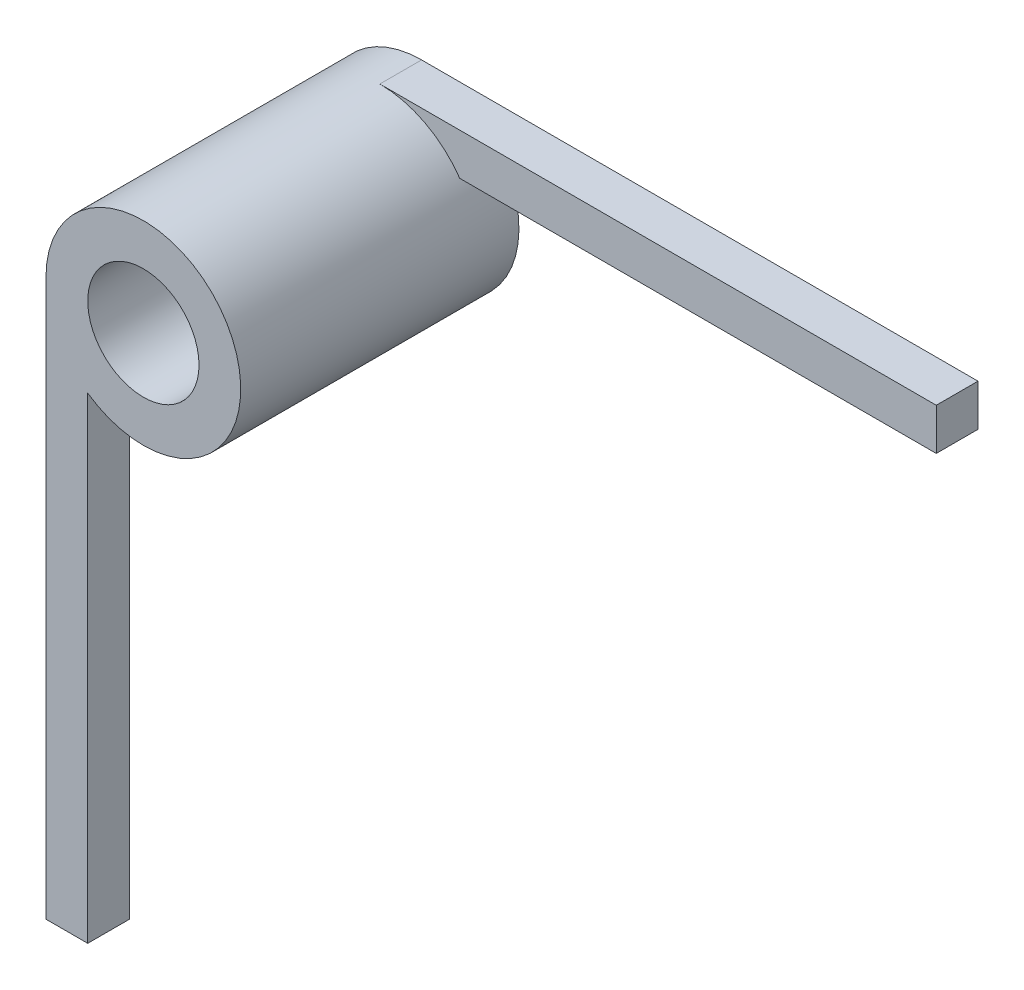
ISO-10303-21;
HEADER;
FILE_DESCRIPTION(('STEP AP214'),'2;1');
FILE_NAME('part.step','',(''),(''),'','','');
FILE_SCHEMA(('AUTOMOTIVE_DESIGN { 1 0 10303 214 1 1 1 1 }'));
ENDSEC;
DATA;
#1=APPLICATION_CONTEXT('core data for automotive mechanical design processes');
#2=APPLICATION_PROTOCOL_DEFINITION('international standard','automotive_design',2000,#1);
#3=PRODUCT_CONTEXT('',#1,'mechanical');
#4=PRODUCT('Part','Part','',(#3));
#5=PRODUCT_RELATED_PRODUCT_CATEGORY('part','',(#4));
#6=PRODUCT_DEFINITION_FORMATION('','',#4);
#7=PRODUCT_DEFINITION_CONTEXT('part definition',#1,'design');
#8=PRODUCT_DEFINITION('design','',#6,#7);
#9=PRODUCT_DEFINITION_SHAPE('','',#8);
#10=(LENGTH_UNIT() NAMED_UNIT(*) SI_UNIT(.MILLI.,.METRE.));
#11=(NAMED_UNIT(*) PLANE_ANGLE_UNIT() SI_UNIT($,.RADIAN.));
#12=(NAMED_UNIT(*) SI_UNIT($,.STERADIAN.) SOLID_ANGLE_UNIT());
#13=UNCERTAINTY_MEASURE_WITH_UNIT(LENGTH_MEASURE(1.E-05),#10,'distance_accuracy_value','');
#14=(GEOMETRIC_REPRESENTATION_CONTEXT(3) GLOBAL_UNCERTAINTY_ASSIGNED_CONTEXT((#13)) GLOBAL_UNIT_ASSIGNED_CONTEXT((#10,
#11,#12)) REPRESENTATION_CONTEXT('',''));
#15=CARTESIAN_POINT('',(0.,0.,0.));
#16=DIRECTION('',(0.,0.,1.));
#17=DIRECTION('',(1.,0.,0.));
#18=AXIS2_PLACEMENT_3D('',#15,#16,#17);
#19=CARTESIAN_POINT('',(0.,0.,2.5));
#20=DIRECTION('',(0.,0.,1.));
#21=DIRECTION('',(1.,0.,0.));
#22=AXIS2_PLACEMENT_3D('',#19,#20,#21);
#23=PLANE('',#22);
#24=CARTESIAN_POINT('',(0.,0.,2.5));
#25=DIRECTION('',(0.,0.,1.));
#26=DIRECTION('',(1.,0.,0.));
#27=AXIS2_PLACEMENT_3D('',#24,#25,#26);
#28=CIRCLE('',#27,1.75);
#29=CARTESIAN_POINT('',(-1.,-1.43614066163451,2.5));
#30=VERTEX_POINT('',#29);
#31=CARTESIAN_POINT('',(-1.75,0.,2.5));
#32=VERTEX_POINT('',#31);
#33=EDGE_CURVE('E11',#30,#32,#28,.T.);
#34=ORIENTED_EDGE('',*,*,#33,.T.);
#35=DIRECTION('',(0.,-1.,0.));
#36=VECTOR('',#35,1.);
#37=CARTESIAN_POINT('',(-1.75,0.,2.5));
#38=LINE('',#37,#36);
#39=CARTESIAN_POINT('',(-1.75,-10.,2.5));
#40=VERTEX_POINT('',#39);
#41=EDGE_CURVE('E132',#32,#40,#38,.T.);
#42=ORIENTED_EDGE('',*,*,#41,.T.);
#43=DIRECTION('',(1.,0.,0.));
#44=VECTOR('',#43,1.);
#45=CARTESIAN_POINT('',(-1.75,-10.,2.5));
#46=LINE('',#45,#44);
#47=CARTESIAN_POINT('',(-1.,-10.,2.5));
#48=VERTEX_POINT('',#47);
#49=EDGE_CURVE('E146',#40,#48,#46,.T.);
#50=ORIENTED_EDGE('',*,*,#49,.T.);
#51=DIRECTION('',(0.,1.,0.));
#52=VECTOR('',#51,1.);
#53=CARTESIAN_POINT('',(-1.,-10.,2.5));
#54=LINE('',#53,#52);
#55=EDGE_CURVE('E137',#48,#30,#54,.T.);
#56=ORIENTED_EDGE('',*,*,#55,.T.);
#57=EDGE_LOOP('',(#34,#42,#50,#56));
#58=FACE_BOUND('',#57,.T.);
#59=CARTESIAN_POINT('',(0.,0.,2.5));
#60=DIRECTION('',(0.,0.,1.));
#61=DIRECTION('',(1.,0.,0.));
#62=AXIS2_PLACEMENT_3D('',#59,#60,#61);
#63=CIRCLE('',#62,1.);
#64=CARTESIAN_POINT('',(1.,0.,2.5));
#65=VERTEX_POINT('',#64);
#66=EDGE_CURVE('E162',#65,#65,#63,.T.);
#67=ORIENTED_EDGE('',*,*,#66,.F.);
#68=EDGE_LOOP('',(#67));
#69=FACE_BOUND('',#68,.T.);
#70=ADVANCED_FACE('F33',(#58,#69),#23,.T.);
#71=CARTESIAN_POINT('',(0.,0.,-2.5));
#72=DIRECTION('',(0.,0.,1.));
#73=DIRECTION('',(1.,0.,0.));
#74=AXIS2_PLACEMENT_3D('',#71,#72,#73);
#75=PLANE('',#74);
#76=CARTESIAN_POINT('',(0.,0.,-2.5));
#77=DIRECTION('',(0.,0.,1.));
#78=DIRECTION('',(1.,0.,0.));
#79=AXIS2_PLACEMENT_3D('',#76,#77,#78);
#80=CIRCLE('',#79,1.);
#81=CARTESIAN_POINT('',(1.,0.,-2.5));
#82=VERTEX_POINT('',#81);
#83=EDGE_CURVE('E161',#82,#82,#80,.T.);
#84=ORIENTED_EDGE('',*,*,#83,.T.);
#85=EDGE_LOOP('',(#84));
#86=FACE_BOUND('',#85,.T.);
#87=CARTESIAN_POINT('',(0.,0.,-2.5));
#88=DIRECTION('',(0.,0.,1.));
#89=DIRECTION('',(1.,0.,0.));
#90=AXIS2_PLACEMENT_3D('',#87,#88,#89);
#91=CIRCLE('',#90,1.75);
#92=CARTESIAN_POINT('',(0.,1.75,-2.5));
#93=VERTEX_POINT('',#92);
#94=CARTESIAN_POINT('',(1.43614066163451,1.,-2.5));
#95=VERTEX_POINT('',#94);
#96=EDGE_CURVE('E37',#93,#95,#91,.T.);
#97=ORIENTED_EDGE('',*,*,#96,.F.);
#98=DIRECTION('',(1.,0.,0.));
#99=VECTOR('',#98,1.);
#100=CARTESIAN_POINT('',(0.,1.75,-2.5));
#101=LINE('',#100,#99);
#102=CARTESIAN_POINT('',(10.,1.75,-2.5));
#103=VERTEX_POINT('',#102);
#104=EDGE_CURVE('E125',#93,#103,#101,.T.);
#105=ORIENTED_EDGE('',*,*,#104,.T.);
#106=DIRECTION('',(0.,-1.,0.));
#107=VECTOR('',#106,1.);
#108=CARTESIAN_POINT('',(10.,1.75,-2.5));
#109=LINE('',#108,#107);
#110=CARTESIAN_POINT('',(10.,1.,-2.5));
#111=VERTEX_POINT('',#110);
#112=EDGE_CURVE('E103',#103,#111,#109,.T.);
#113=ORIENTED_EDGE('',*,*,#112,.T.);
#114=DIRECTION('',(-1.,0.,0.));
#115=VECTOR('',#114,1.);
#116=CARTESIAN_POINT('',(10.,1.,-2.5));
#117=LINE('',#116,#115);
#118=EDGE_CURVE('E119',#111,#95,#117,.T.);
#119=ORIENTED_EDGE('',*,*,#118,.T.);
#120=EDGE_LOOP('',(#97,#105,#113,#119));
#121=FACE_BOUND('',#120,.T.);
#122=ADVANCED_FACE('F168',(#86,#121),#75,.F.);
#123=CARTESIAN_POINT('',(0.,0.,2.5));
#124=DIRECTION('',(0.,0.,-1.));
#125=DIRECTION('',(-1.,0.,0.));
#126=AXIS2_PLACEMENT_3D('',#123,#124,#125);
#127=CYLINDRICAL_SURFACE('',#126,1.75);
#128=ORIENTED_EDGE('',*,*,#96,.T.);
#129=DIRECTION('',(0.,0.,-1.));
#130=VECTOR('',#129,1.);
#131=CARTESIAN_POINT('',(1.43614066163451,1.,2.5));
#132=LINE('',#131,#130);
#133=CARTESIAN_POINT('',(1.43614066163451,1.,-1.75));
#134=VERTEX_POINT('',#133);
#135=EDGE_CURVE('E48',#95,#134,#132,.F.);
#136=ORIENTED_EDGE('',*,*,#135,.T.);
#137=CARTESIAN_POINT('',(0.,0.,-1.75));
#138=DIRECTION('',(0.,0.,-1.));
#139=DIRECTION('',(-1.,0.,0.));
#140=AXIS2_PLACEMENT_3D('',#137,#138,#139);
#141=CIRCLE('',#140,1.75);
#142=CARTESIAN_POINT('',(0.,1.75,-1.75));
#143=VERTEX_POINT('',#142);
#144=EDGE_CURVE('E52',#143,#134,#141,.T.);
#145=ORIENTED_EDGE('',*,*,#144,.F.);
#146=DIRECTION('',(0.,0.,-1.));
#147=VECTOR('',#146,1.);
#148=CARTESIAN_POINT('',(0.,1.75,-1.75));
#149=LINE('',#148,#147);
#150=EDGE_CURVE('E109',#143,#93,#149,.T.);
#151=ORIENTED_EDGE('',*,*,#150,.T.);
#152=EDGE_LOOP('',(#128,#136,#145,#151));
#153=FACE_BOUND('',#152,.T.);
#154=ORIENTED_EDGE('',*,*,#33,.F.);
#155=DIRECTION('',(0.,0.,-1.));
#156=VECTOR('',#155,1.);
#157=CARTESIAN_POINT('',(-1.,-1.43614066163451,2.5));
#158=LINE('',#157,#156);
#159=CARTESIAN_POINT('',(-1.,-1.43614066163451,1.75));
#160=VERTEX_POINT('',#159);
#161=EDGE_CURVE('E158',#30,#160,#158,.T.);
#162=ORIENTED_EDGE('',*,*,#161,.T.);
#163=CARTESIAN_POINT('',(0.,0.,1.75));
#164=DIRECTION('',(0.,0.,1.));
#165=DIRECTION('',(1.,0.,0.));
#166=AXIS2_PLACEMENT_3D('',#163,#164,#165);
#167=CIRCLE('',#166,1.75);
#168=CARTESIAN_POINT('',(-1.75,0.,1.75));
#169=VERTEX_POINT('',#168);
#170=EDGE_CURVE('E152',#169,#160,#167,.T.);
#171=ORIENTED_EDGE('',*,*,#170,.F.);
#172=DIRECTION('',(0.,0.,1.));
#173=VECTOR('',#172,1.);
#174=CARTESIAN_POINT('',(-1.75,0.,1.75));
#175=LINE('',#174,#173);
#176=EDGE_CURVE('E143',#169,#32,#175,.T.);
#177=ORIENTED_EDGE('',*,*,#176,.T.);
#178=EDGE_LOOP('',(#154,#162,#171,#177));
#179=FACE_BOUND('',#178,.T.);
#180=ADVANCED_FACE('F35',(#153,#179),#127,.T.);
#181=CARTESIAN_POINT('',(0.,0.,2.5));
#182=DIRECTION('',(0.,0.,-1.));
#183=DIRECTION('',(-1.,0.,0.));
#184=AXIS2_PLACEMENT_3D('',#181,#182,#183);
#185=CYLINDRICAL_SURFACE('',#184,1.);
#186=ORIENTED_EDGE('',*,*,#83,.F.);
#187=EDGE_LOOP('',(#186));
#188=FACE_BOUND('',#187,.T.);
#189=ORIENTED_EDGE('',*,*,#66,.T.);
#190=EDGE_LOOP('',(#189));
#191=FACE_BOUND('',#190,.T.);
#192=ADVANCED_FACE('F171',(#188,#191),#185,.F.);
#193=CARTESIAN_POINT('',(-1.,-10.,1.75));
#194=DIRECTION('',(1.,0.,0.));
#195=DIRECTION('',(0.,0.,-1.));
#196=AXIS2_PLACEMENT_3D('',#193,#194,#195);
#197=PLANE('',#196);
#198=ORIENTED_EDGE('',*,*,#161,.F.);
#199=ORIENTED_EDGE('',*,*,#55,.F.);
#200=DIRECTION('',(0.,0.,1.));
#201=VECTOR('',#200,1.);
#202=CARTESIAN_POINT('',(-1.,-10.,1.75));
#203=LINE('',#202,#201);
#204=CARTESIAN_POINT('',(-1.,-10.,1.75));
#205=VERTEX_POINT('',#204);
#206=EDGE_CURVE('E150',#205,#48,#203,.T.);
#207=ORIENTED_EDGE('',*,*,#206,.F.);
#208=DIRECTION('',(0.,1.,0.));
#209=VECTOR('',#208,1.);
#210=CARTESIAN_POINT('',(-1.,-10.,1.75));
#211=LINE('',#210,#209);
#212=EDGE_CURVE('E140',#205,#160,#211,.T.);
#213=ORIENTED_EDGE('',*,*,#212,.T.);
#214=EDGE_LOOP('',(#198,#199,#207,#213));
#215=FACE_BOUND('',#214,.T.);
#216=ADVANCED_FACE('F174',(#215),#197,.T.);
#217=CARTESIAN_POINT('',(-1.75,-10.,1.75));
#218=DIRECTION('',(0.,-1.,0.));
#219=DIRECTION('',(0.,0.,-1.));
#220=AXIS2_PLACEMENT_3D('',#217,#218,#219);
#221=PLANE('',#220);
#222=ORIENTED_EDGE('',*,*,#49,.F.);
#223=DIRECTION('',(0.,0.,1.));
#224=VECTOR('',#223,1.);
#225=CARTESIAN_POINT('',(-1.75,-10.,1.75));
#226=LINE('',#225,#224);
#227=CARTESIAN_POINT('',(-1.75,-10.,1.75));
#228=VERTEX_POINT('',#227);
#229=EDGE_CURVE('E153',#228,#40,#226,.T.);
#230=ORIENTED_EDGE('',*,*,#229,.F.);
#231=DIRECTION('',(1.,0.,0.));
#232=VECTOR('',#231,1.);
#233=CARTESIAN_POINT('',(-1.75,-10.,1.75));
#234=LINE('',#233,#232);
#235=EDGE_CURVE('E136',#228,#205,#234,.T.);
#236=ORIENTED_EDGE('',*,*,#235,.T.);
#237=ORIENTED_EDGE('',*,*,#206,.T.);
#238=EDGE_LOOP('',(#222,#230,#236,#237));
#239=FACE_BOUND('',#238,.T.);
#240=ADVANCED_FACE('F189',(#239),#221,.T.);
#241=CARTESIAN_POINT('',(-1.75,0.,1.75));
#242=DIRECTION('',(-1.,0.,0.));
#243=DIRECTION('',(0.,-1.,0.));
#244=AXIS2_PLACEMENT_3D('',#241,#242,#243);
#245=PLANE('',#244);
#246=ORIENTED_EDGE('',*,*,#41,.F.);
#247=ORIENTED_EDGE('',*,*,#176,.F.);
#248=DIRECTION('',(0.,-1.,0.));
#249=VECTOR('',#248,1.);
#250=CARTESIAN_POINT('',(-1.75,0.,1.75));
#251=LINE('',#250,#249);
#252=EDGE_CURVE('E133',#169,#228,#251,.T.);
#253=ORIENTED_EDGE('',*,*,#252,.T.);
#254=ORIENTED_EDGE('',*,*,#229,.T.);
#255=EDGE_LOOP('',(#246,#247,#253,#254));
#256=FACE_BOUND('',#255,.T.);
#257=ADVANCED_FACE('F185',(#256),#245,.T.);
#258=CARTESIAN_POINT('',(0.,0.,1.75));
#259=DIRECTION('',(0.,0.,1.));
#260=DIRECTION('',(1.,0.,0.));
#261=AXIS2_PLACEMENT_3D('',#258,#259,#260);
#262=PLANE('',#261);
#263=ORIENTED_EDGE('',*,*,#252,.F.);
#264=ORIENTED_EDGE('',*,*,#170,.T.);
#265=ORIENTED_EDGE('',*,*,#212,.F.);
#266=ORIENTED_EDGE('',*,*,#235,.F.);
#267=EDGE_LOOP('',(#263,#264,#265,#266));
#268=FACE_BOUND('',#267,.T.);
#269=ADVANCED_FACE('F188',(#268),#262,.F.);
#270=CARTESIAN_POINT('',(10.,1.,-1.75));
#271=DIRECTION('',(0.,-1.,0.));
#272=DIRECTION('',(0.,0.,-1.));
#273=AXIS2_PLACEMENT_3D('',#270,#271,#272);
#274=PLANE('',#273);
#275=ORIENTED_EDGE('',*,*,#135,.F.);
#276=ORIENTED_EDGE('',*,*,#118,.F.);
#277=DIRECTION('',(0.,0.,-1.));
#278=VECTOR('',#277,1.);
#279=CARTESIAN_POINT('',(10.,1.,-1.75));
#280=LINE('',#279,#278);
#281=CARTESIAN_POINT('',(10.,1.,-1.75));
#282=VERTEX_POINT('',#281);
#283=EDGE_CURVE('E108',#282,#111,#280,.T.);
#284=ORIENTED_EDGE('',*,*,#283,.F.);
#285=DIRECTION('',(-1.,0.,0.));
#286=VECTOR('',#285,1.);
#287=CARTESIAN_POINT('',(10.,1.,-1.75));
#288=LINE('',#287,#286);
#289=EDGE_CURVE('E116',#282,#134,#288,.T.);
#290=ORIENTED_EDGE('',*,*,#289,.T.);
#291=EDGE_LOOP('',(#275,#276,#284,#290));
#292=FACE_BOUND('',#291,.T.);
#293=ADVANCED_FACE('F199',(#292),#274,.T.);
#294=CARTESIAN_POINT('',(10.,1.75,-1.75));
#295=DIRECTION('',(1.,0.,0.));
#296=DIRECTION('',(0.,0.,-1.));
#297=AXIS2_PLACEMENT_3D('',#294,#295,#296);
#298=PLANE('',#297);
#299=ORIENTED_EDGE('',*,*,#112,.F.);
#300=DIRECTION('',(0.,0.,-1.));
#301=VECTOR('',#300,1.);
#302=CARTESIAN_POINT('',(10.,1.75,-1.75));
#303=LINE('',#302,#301);
#304=CARTESIAN_POINT('',(10.,1.75,-1.75));
#305=VERTEX_POINT('',#304);
#306=EDGE_CURVE('E97',#305,#103,#303,.T.);
#307=ORIENTED_EDGE('',*,*,#306,.F.);
#308=DIRECTION('',(0.,-1.,0.));
#309=VECTOR('',#308,1.);
#310=CARTESIAN_POINT('',(10.,1.75,-1.75));
#311=LINE('',#310,#309);
#312=EDGE_CURVE('E100',#305,#282,#311,.T.);
#313=ORIENTED_EDGE('',*,*,#312,.T.);
#314=ORIENTED_EDGE('',*,*,#283,.T.);
#315=EDGE_LOOP('',(#299,#307,#313,#314));
#316=FACE_BOUND('',#315,.T.);
#317=ADVANCED_FACE('F99',(#316),#298,.T.);
#318=CARTESIAN_POINT('',(0.,1.75,-1.75));
#319=DIRECTION('',(0.,1.,0.));
#320=DIRECTION('',(-1.,0.,0.));
#321=AXIS2_PLACEMENT_3D('',#318,#319,#320);
#322=PLANE('',#321);
#323=ORIENTED_EDGE('',*,*,#104,.F.);
#324=ORIENTED_EDGE('',*,*,#150,.F.);
#325=DIRECTION('',(1.,0.,0.));
#326=VECTOR('',#325,1.);
#327=CARTESIAN_POINT('',(0.,1.75,-1.75));
#328=LINE('',#327,#326);
#329=EDGE_CURVE('E114',#143,#305,#328,.T.);
#330=ORIENTED_EDGE('',*,*,#329,.T.);
#331=ORIENTED_EDGE('',*,*,#306,.T.);
#332=EDGE_LOOP('',(#323,#324,#330,#331));
#333=FACE_BOUND('',#332,.T.);
#334=ADVANCED_FACE('F118',(#333),#322,.T.);
#335=CARTESIAN_POINT('',(0.,0.,-1.75));
#336=DIRECTION('',(0.,0.,-1.));
#337=DIRECTION('',(-1.,0.,0.));
#338=AXIS2_PLACEMENT_3D('',#335,#336,#337);
#339=PLANE('',#338);
#340=ORIENTED_EDGE('',*,*,#329,.F.);
#341=ORIENTED_EDGE('',*,*,#144,.T.);
#342=ORIENTED_EDGE('',*,*,#289,.F.);
#343=ORIENTED_EDGE('',*,*,#312,.F.);
#344=EDGE_LOOP('',(#340,#341,#342,#343));
#345=FACE_BOUND('',#344,.T.);
#346=ADVANCED_FACE('F113',(#345),#339,.F.);
#347=CLOSED_SHELL('',(#70,#122,#180,#192,#216,#240,#257,#269,#293,#317,#334,#346));
#348=MANIFOLD_SOLID_BREP('B2',#347);
#349=ADVANCED_BREP_SHAPE_REPRESENTATION('',(#18,#348),#14);
#350=SHAPE_DEFINITION_REPRESENTATION(#9,#349);
ENDSEC;
END-ISO-10303-21;
